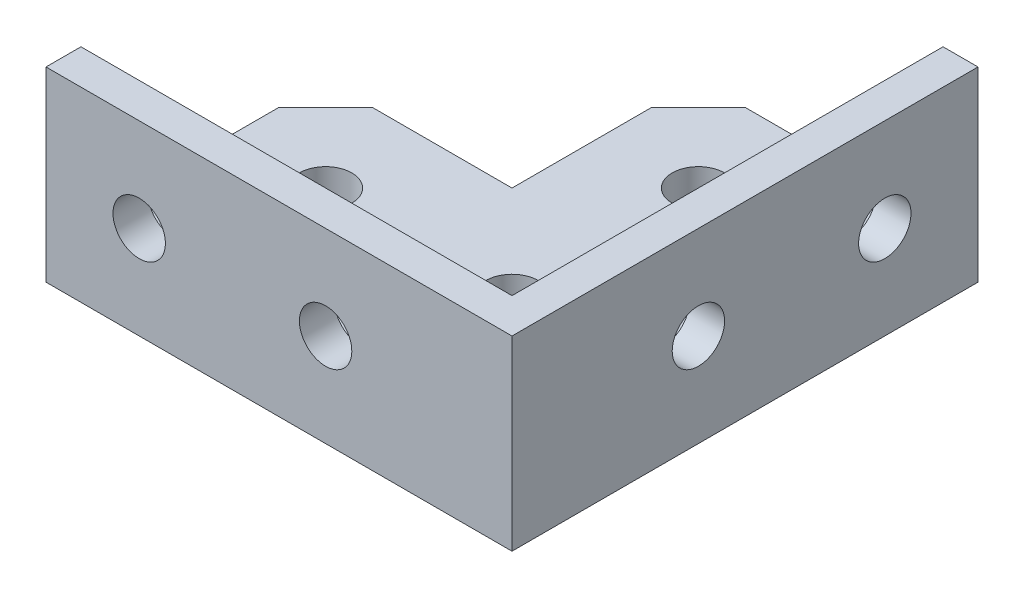
ISO-10303-21;
HEADER;
FILE_DESCRIPTION(('STEP AP214'),'2;1');
FILE_NAME('part.step','',(''),(''),'','','');
FILE_SCHEMA(('AUTOMOTIVE_DESIGN { 1 0 10303 214 1 1 1 1 }'));
ENDSEC;
DATA;
#1=APPLICATION_CONTEXT('core data for automotive mechanical design processes');
#2=APPLICATION_PROTOCOL_DEFINITION('international standard','automotive_design',2000,#1);
#3=PRODUCT_CONTEXT('',#1,'mechanical');
#4=PRODUCT('Part','Part','',(#3));
#5=PRODUCT_RELATED_PRODUCT_CATEGORY('part','',(#4));
#6=PRODUCT_DEFINITION_FORMATION('','',#4);
#7=PRODUCT_DEFINITION_CONTEXT('part definition',#1,'design');
#8=PRODUCT_DEFINITION('design','',#6,#7);
#9=PRODUCT_DEFINITION_SHAPE('','',#8);
#10=(LENGTH_UNIT() NAMED_UNIT(*) SI_UNIT(.MILLI.,.METRE.));
#11=(NAMED_UNIT(*) PLANE_ANGLE_UNIT() SI_UNIT($,.RADIAN.));
#12=(NAMED_UNIT(*) SI_UNIT($,.STERADIAN.) SOLID_ANGLE_UNIT());
#13=UNCERTAINTY_MEASURE_WITH_UNIT(LENGTH_MEASURE(1.E-05),#10,'distance_accuracy_value','');
#14=(GEOMETRIC_REPRESENTATION_CONTEXT(3) GLOBAL_UNCERTAINTY_ASSIGNED_CONTEXT((#13)) GLOBAL_UNIT_ASSIGNED_CONTEXT((#10,
#11,#12)) REPRESENTATION_CONTEXT('',''));
#15=CARTESIAN_POINT('',(0.,0.,0.));
#16=DIRECTION('',(0.,0.,1.));
#17=DIRECTION('',(1.,0.,0.));
#18=AXIS2_PLACEMENT_3D('',#15,#16,#17);
#19=CARTESIAN_POINT('',(33.3375,4.7625,63.5));
#20=DIRECTION('',(0.,-1.,0.));
#21=DIRECTION('',(1.,0.,0.));
#22=AXIS2_PLACEMENT_3D('',#19,#20,#21);
#23=PLANE('',#22);
#24=DIRECTION('',(-1.,0.,0.));
#25=VECTOR('',#24,1.);
#26=CARTESIAN_POINT('',(38.1,4.7625,25.4));
#27=LINE('',#26,#25);
#28=CARTESIAN_POINT('',(0.,4.7625,25.4));
#29=VERTEX_POINT('',#28);
#30=CARTESIAN_POINT('',(-19.05,4.7625,25.4));
#31=VERTEX_POINT('',#30);
#32=EDGE_CURVE('E180',#29,#31,#27,.T.);
#33=ORIENTED_EDGE('',*,*,#32,.T.);
#34=DIRECTION('',(0.707106781186549,0.,-0.707106781186546));
#35=VECTOR('',#34,1.);
#36=CARTESIAN_POINT('',(-25.4,4.7625,31.75));
#37=LINE('',#36,#35);
#38=CARTESIAN_POINT('',(-25.4,4.7625,31.75));
#39=VERTEX_POINT('',#38);
#40=EDGE_CURVE('E277',#31,#39,#37,.F.);
#41=ORIENTED_EDGE('',*,*,#40,.T.);
#42=DIRECTION('',(0.,0.,-1.));
#43=VECTOR('',#42,1.);
#44=CARTESIAN_POINT('',(-25.4,4.7625,58.7375));
#45=LINE('',#44,#43);
#46=CARTESIAN_POINT('',(-25.4,4.7625,58.7375));
#47=VERTEX_POINT('',#46);
#48=EDGE_CURVE('E175',#47,#39,#45,.T.);
#49=ORIENTED_EDGE('',*,*,#48,.F.);
#50=DIRECTION('',(-1.,0.,0.));
#51=VECTOR('',#50,1.);
#52=CARTESIAN_POINT('',(38.1,4.7625,58.7375));
#53=LINE('',#52,#51);
#54=CARTESIAN_POINT('',(33.3375,4.7625,58.7375));
#55=VERTEX_POINT('',#54);
#56=EDGE_CURVE('E156',#55,#47,#53,.T.);
#57=ORIENTED_EDGE('',*,*,#56,.F.);
#58=DIRECTION('',(0.,0.,-1.));
#59=VECTOR('',#58,1.);
#60=CARTESIAN_POINT('',(33.3375,4.7625,63.5));
#61=LINE('',#60,#59);
#62=CARTESIAN_POINT('',(33.3375,4.7625,0.));
#63=VERTEX_POINT('',#62);
#64=EDGE_CURVE('E259',#55,#63,#61,.T.);
#65=ORIENTED_EDGE('',*,*,#64,.T.);
#66=DIRECTION('',(-1.,0.,0.));
#67=VECTOR('',#66,1.);
#68=CARTESIAN_POINT('',(33.3375,4.7625,0.));
#69=LINE('',#68,#67);
#70=CARTESIAN_POINT('',(6.35000000000001,4.7625,0.));
#71=VERTEX_POINT('',#70);
#72=EDGE_CURVE('E231',#63,#71,#69,.T.);
#73=ORIENTED_EDGE('',*,*,#72,.T.);
#74=DIRECTION('',(-0.707106781186548,0.,0.707106781186547));
#75=VECTOR('',#74,1.);
#76=CARTESIAN_POINT('',(0.,4.7625,6.34999999999999));
#77=LINE('',#76,#75);
#78=CARTESIAN_POINT('',(0.,4.7625,6.34999999999999));
#79=VERTEX_POINT('',#78);
#80=EDGE_CURVE('E73',#71,#79,#77,.T.);
#81=ORIENTED_EDGE('',*,*,#80,.T.);
#82=DIRECTION('',(0.,0.,-1.));
#83=VECTOR('',#82,1.);
#84=CARTESIAN_POINT('',(0.,4.7625,63.5));
#85=LINE('',#84,#83);
#86=EDGE_CURVE('E256',#29,#79,#85,.T.);
#87=ORIENTED_EDGE('',*,*,#86,.F.);
#88=EDGE_LOOP('',(#33,#41,#49,#57,#65,#73,#81,#87));
#89=FACE_BOUND('',#88,.T.);
#90=CARTESIAN_POINT('',(12.7,4.7625,12.7));
#91=DIRECTION('',(0.,1.,0.));
#92=DIRECTION('',(0.,0.,1.));
#93=AXIS2_PLACEMENT_3D('',#90,#91,#92);
#94=CIRCLE('',#93,3.57124);
#95=CARTESIAN_POINT('',(12.7,4.7625,16.27124));
#96=VERTEX_POINT('',#95);
#97=EDGE_CURVE('E209',#96,#96,#94,.T.);
#98=ORIENTED_EDGE('',*,*,#97,.F.);
#99=EDGE_LOOP('',(#98));
#100=FACE_BOUND('',#99,.T.);
#101=CARTESIAN_POINT('',(-12.7,4.7625,38.1));
#102=DIRECTION('',(0.,1.,0.));
#103=DIRECTION('',(0.,0.,1.));
#104=AXIS2_PLACEMENT_3D('',#101,#102,#103);
#105=CIRCLE('',#104,3.57124);
#106=CARTESIAN_POINT('',(-12.7,4.7625,41.67124));
#107=VERTEX_POINT('',#106);
#108=EDGE_CURVE('E409',#107,#107,#105,.T.);
#109=ORIENTED_EDGE('',*,*,#108,.F.);
#110=EDGE_LOOP('',(#109));
#111=FACE_BOUND('',#110,.T.);
#112=CARTESIAN_POINT('',(12.7,4.7625,38.1));
#113=DIRECTION('',(0.,1.,0.));
#114=DIRECTION('',(0.,0.,1.));
#115=AXIS2_PLACEMENT_3D('',#112,#113,#114);
#116=CIRCLE('',#115,3.57124);
#117=CARTESIAN_POINT('',(12.7,4.7625,41.67124));
#118=VERTEX_POINT('',#117);
#119=EDGE_CURVE('E401',#118,#118,#116,.T.);
#120=ORIENTED_EDGE('',*,*,#119,.F.);
#121=EDGE_LOOP('',(#120));
#122=FACE_BOUND('',#121,.T.);
#123=ADVANCED_FACE('F51',(#89,#100,#111,#122),#23,.F.);
#124=CARTESIAN_POINT('',(33.3375,25.4,63.5));
#125=DIRECTION('',(1.,0.,0.));
#126=DIRECTION('',(0.,0.,-1.));
#127=AXIS2_PLACEMENT_3D('',#124,#125,#126);
#128=PLANE('',#127);
#129=ORIENTED_EDGE('',*,*,#64,.F.);
#130=DIRECTION('',(0.,1.,0.));
#131=VECTOR('',#130,1.);
#132=CARTESIAN_POINT('',(33.3375,25.4,58.7375));
#133=LINE('',#132,#131);
#134=CARTESIAN_POINT('',(33.3375,25.4,58.7375));
#135=VERTEX_POINT('',#134);
#136=EDGE_CURVE('E150',#55,#135,#133,.T.);
#137=ORIENTED_EDGE('',*,*,#136,.T.);
#138=DIRECTION('',(0.,0.,-1.));
#139=VECTOR('',#138,1.);
#140=CARTESIAN_POINT('',(33.3375,25.4,63.5));
#141=LINE('',#140,#139);
#142=CARTESIAN_POINT('',(33.3375,25.4,0.));
#143=VERTEX_POINT('',#142);
#144=EDGE_CURVE('E146',#135,#143,#141,.T.);
#145=ORIENTED_EDGE('',*,*,#144,.T.);
#146=DIRECTION('',(0.,-1.,0.));
#147=VECTOR('',#146,1.);
#148=CARTESIAN_POINT('',(33.3375,25.4,0.));
#149=LINE('',#148,#147);
#150=EDGE_CURVE('E217',#143,#63,#149,.T.);
#151=ORIENTED_EDGE('',*,*,#150,.T.);
#152=EDGE_LOOP('',(#129,#137,#145,#151));
#153=FACE_BOUND('',#152,.T.);
#154=CARTESIAN_POINT('',(33.3375,12.7,38.1));
#155=DIRECTION('',(-1.,0.,0.));
#156=DIRECTION('',(0.,0.,1.));
#157=AXIS2_PLACEMENT_3D('',#154,#155,#156);
#158=CIRCLE('',#157,3.57124);
#159=CARTESIAN_POINT('',(33.3375,12.7,41.67124));
#160=VERTEX_POINT('',#159);
#161=EDGE_CURVE('E201',#160,#160,#158,.T.);
#162=ORIENTED_EDGE('',*,*,#161,.F.);
#163=EDGE_LOOP('',(#162));
#164=FACE_BOUND('',#163,.T.);
#165=CARTESIAN_POINT('',(33.3375,12.7,12.7));
#166=DIRECTION('',(-1.,0.,0.));
#167=DIRECTION('',(0.,0.,1.));
#168=AXIS2_PLACEMENT_3D('',#165,#166,#167);
#169=CIRCLE('',#168,3.57124);
#170=CARTESIAN_POINT('',(33.3375,12.7,16.27124));
#171=VERTEX_POINT('',#170);
#172=EDGE_CURVE('E193',#171,#171,#169,.T.);
#173=ORIENTED_EDGE('',*,*,#172,.F.);
#174=EDGE_LOOP('',(#173));
#175=FACE_BOUND('',#174,.T.);
#176=ADVANCED_FACE('F314',(#153,#164,#175),#128,.F.);
#177=CARTESIAN_POINT('',(0.,4.7625,63.5));
#178=DIRECTION('',(1.,0.,0.));
#179=DIRECTION('',(0.,1.,0.));
#180=AXIS2_PLACEMENT_3D('',#177,#178,#179);
#181=PLANE('',#180);
#182=ORIENTED_EDGE('',*,*,#86,.T.);
#183=DIRECTION('',(0.,-1.,0.));
#184=VECTOR('',#183,1.);
#185=CARTESIAN_POINT('',(0.,0.,6.34999999999999));
#186=LINE('',#185,#184);
#187=CARTESIAN_POINT('',(0.,0.,6.34999999999999));
#188=VERTEX_POINT('',#187);
#189=EDGE_CURVE('E61',#79,#188,#186,.T.);
#190=ORIENTED_EDGE('',*,*,#189,.T.);
#191=DIRECTION('',(0.,0.,-1.));
#192=VECTOR('',#191,1.);
#193=CARTESIAN_POINT('',(0.,0.,63.5));
#194=LINE('',#193,#192);
#195=CARTESIAN_POINT('',(0.,0.,25.4));
#196=VERTEX_POINT('',#195);
#197=EDGE_CURVE('E252',#196,#188,#194,.T.);
#198=ORIENTED_EDGE('',*,*,#197,.F.);
#199=DIRECTION('',(0.,1.,0.));
#200=VECTOR('',#199,1.);
#201=CARTESIAN_POINT('',(0.,4.7625,25.4));
#202=LINE('',#201,#200);
#203=EDGE_CURVE('E189',#196,#29,#202,.T.);
#204=ORIENTED_EDGE('',*,*,#203,.T.);
#205=EDGE_LOOP('',(#182,#190,#198,#204));
#206=FACE_BOUND('',#205,.T.);
#207=ADVANCED_FACE('F283',(#206),#181,.F.);
#208=CARTESIAN_POINT('',(0.,0.,63.5));
#209=DIRECTION('',(0.,1.,0.));
#210=DIRECTION('',(0.,0.,1.));
#211=AXIS2_PLACEMENT_3D('',#208,#209,#210);
#212=PLANE('',#211);
#213=CARTESIAN_POINT('',(12.7,0.,38.1));
#214=DIRECTION('',(0.,1.,0.));
#215=DIRECTION('',(0.,0.,1.));
#216=AXIS2_PLACEMENT_3D('',#213,#214,#215);
#217=CIRCLE('',#216,3.57124);
#218=CARTESIAN_POINT('',(12.7,0.,41.67124));
#219=VERTEX_POINT('',#218);
#220=EDGE_CURVE('E405',#219,#219,#217,.T.);
#221=ORIENTED_EDGE('',*,*,#220,.T.);
#222=EDGE_LOOP('',(#221));
#223=FACE_BOUND('',#222,.T.);
#224=CARTESIAN_POINT('',(-12.7,0.,38.1));
#225=DIRECTION('',(0.,1.,0.));
#226=DIRECTION('',(0.,0.,1.));
#227=AXIS2_PLACEMENT_3D('',#224,#225,#226);
#228=CIRCLE('',#227,3.57124);
#229=CARTESIAN_POINT('',(-12.7,0.,41.67124));
#230=VERTEX_POINT('',#229);
#231=EDGE_CURVE('E161',#230,#230,#228,.T.);
#232=ORIENTED_EDGE('',*,*,#231,.T.);
#233=EDGE_LOOP('',(#232));
#234=FACE_BOUND('',#233,.T.);
#235=CARTESIAN_POINT('',(12.7,0.,12.7));
#236=DIRECTION('',(0.,1.,0.));
#237=DIRECTION('',(0.,0.,1.));
#238=AXIS2_PLACEMENT_3D('',#235,#236,#237);
#239=CIRCLE('',#238,3.57124);
#240=CARTESIAN_POINT('',(12.7,0.,16.27124));
#241=VERTEX_POINT('',#240);
#242=EDGE_CURVE('E213',#241,#241,#239,.T.);
#243=ORIENTED_EDGE('',*,*,#242,.T.);
#244=EDGE_LOOP('',(#243));
#245=FACE_BOUND('',#244,.T.);
#246=DIRECTION('',(0.,0.,1.));
#247=VECTOR('',#246,1.);
#248=CARTESIAN_POINT('',(-25.4,0.,25.4));
#249=LINE('',#248,#247);
#250=CARTESIAN_POINT('',(-25.4,0.,31.75));
#251=VERTEX_POINT('',#250);
#252=CARTESIAN_POINT('',(-25.4,0.,63.5));
#253=VERTEX_POINT('',#252);
#254=EDGE_CURVE('E169',#251,#253,#249,.T.);
#255=ORIENTED_EDGE('',*,*,#254,.F.);
#256=DIRECTION('',(-0.707106781186549,0.,0.707106781186546));
#257=VECTOR('',#256,1.);
#258=CARTESIAN_POINT('',(-25.4,0.,31.75));
#259=LINE('',#258,#257);
#260=CARTESIAN_POINT('',(-19.05,0.,25.4));
#261=VERTEX_POINT('',#260);
#262=EDGE_CURVE('E269',#251,#261,#259,.F.);
#263=ORIENTED_EDGE('',*,*,#262,.T.);
#264=DIRECTION('',(-1.,0.,0.));
#265=VECTOR('',#264,1.);
#266=CARTESIAN_POINT('',(38.1,0.,25.4));
#267=LINE('',#266,#265);
#268=EDGE_CURVE('E151',#196,#261,#267,.T.);
#269=ORIENTED_EDGE('',*,*,#268,.F.);
#270=ORIENTED_EDGE('',*,*,#197,.T.);
#271=DIRECTION('',(0.707106781186548,0.,-0.707106781186547));
#272=VECTOR('',#271,1.);
#273=CARTESIAN_POINT('',(0.,0.,6.34999999999999));
#274=LINE('',#273,#272);
#275=CARTESIAN_POINT('',(6.35000000000001,0.,0.));
#276=VERTEX_POINT('',#275);
#277=EDGE_CURVE('E266',#188,#276,#274,.T.);
#278=ORIENTED_EDGE('',*,*,#277,.T.);
#279=DIRECTION('',(1.,0.,0.));
#280=VECTOR('',#279,1.);
#281=CARTESIAN_POINT('',(0.,0.,0.));
#282=LINE('',#281,#280);
#283=CARTESIAN_POINT('',(38.1,0.,0.));
#284=VERTEX_POINT('',#283);
#285=EDGE_CURVE('E234',#276,#284,#282,.T.);
#286=ORIENTED_EDGE('',*,*,#285,.T.);
#287=DIRECTION('',(0.,0.,-1.));
#288=VECTOR('',#287,1.);
#289=CARTESIAN_POINT('',(38.1,0.,63.5));
#290=LINE('',#289,#288);
#291=CARTESIAN_POINT('',(38.1,0.,63.5));
#292=VERTEX_POINT('',#291);
#293=EDGE_CURVE('E248',#292,#284,#290,.T.);
#294=ORIENTED_EDGE('',*,*,#293,.F.);
#295=DIRECTION('',(1.,0.,0.));
#296=VECTOR('',#295,1.);
#297=CARTESIAN_POINT('',(0.,0.,63.5));
#298=LINE('',#297,#296);
#299=EDGE_CURVE('E218',#253,#292,#298,.T.);
#300=ORIENTED_EDGE('',*,*,#299,.F.);
#301=EDGE_LOOP('',(#255,#263,#269,#270,#278,#286,#294,#300));
#302=FACE_BOUND('',#301,.T.);
#303=ADVANCED_FACE('F289',(#223,#234,#245,#302),#212,.F.);
#304=CARTESIAN_POINT('',(38.1,0.,63.5));
#305=DIRECTION('',(-1.,0.,0.));
#306=DIRECTION('',(0.,0.,1.));
#307=AXIS2_PLACEMENT_3D('',#304,#305,#306);
#308=PLANE('',#307);
#309=ORIENTED_EDGE('',*,*,#293,.T.);
#310=DIRECTION('',(0.,1.,0.));
#311=VECTOR('',#310,1.);
#312=CARTESIAN_POINT('',(38.1,0.,0.));
#313=LINE('',#312,#311);
#314=CARTESIAN_POINT('',(38.1,25.4,0.));
#315=VERTEX_POINT('',#314);
#316=EDGE_CURVE('E237',#284,#315,#313,.T.);
#317=ORIENTED_EDGE('',*,*,#316,.T.);
#318=DIRECTION('',(0.,0.,-1.));
#319=VECTOR('',#318,1.);
#320=CARTESIAN_POINT('',(38.1,25.4,63.5));
#321=LINE('',#320,#319);
#322=CARTESIAN_POINT('',(38.1,25.4,63.5));
#323=VERTEX_POINT('',#322);
#324=EDGE_CURVE('E245',#323,#315,#321,.T.);
#325=ORIENTED_EDGE('',*,*,#324,.F.);
#326=DIRECTION('',(0.,1.,0.));
#327=VECTOR('',#326,1.);
#328=CARTESIAN_POINT('',(38.1,0.,63.5));
#329=LINE('',#328,#327);
#330=EDGE_CURVE('E221',#292,#323,#329,.T.);
#331=ORIENTED_EDGE('',*,*,#330,.F.);
#332=EDGE_LOOP('',(#309,#317,#325,#331));
#333=FACE_BOUND('',#332,.T.);
#334=CARTESIAN_POINT('',(38.1,12.7,12.7));
#335=DIRECTION('',(-1.,0.,0.));
#336=DIRECTION('',(0.,0.,1.));
#337=AXIS2_PLACEMENT_3D('',#334,#335,#336);
#338=CIRCLE('',#337,3.57124);
#339=CARTESIAN_POINT('',(38.1,12.7,16.27124));
#340=VERTEX_POINT('',#339);
#341=EDGE_CURVE('E197',#340,#340,#338,.T.);
#342=ORIENTED_EDGE('',*,*,#341,.T.);
#343=EDGE_LOOP('',(#342));
#344=FACE_BOUND('',#343,.T.);
#345=CARTESIAN_POINT('',(38.1,12.7,38.1));
#346=DIRECTION('',(-1.,0.,0.));
#347=DIRECTION('',(0.,0.,1.));
#348=AXIS2_PLACEMENT_3D('',#345,#346,#347);
#349=CIRCLE('',#348,3.57124);
#350=CARTESIAN_POINT('',(38.1,12.7,41.67124));
#351=VERTEX_POINT('',#350);
#352=EDGE_CURVE('E205',#351,#351,#349,.T.);
#353=ORIENTED_EDGE('',*,*,#352,.T.);
#354=EDGE_LOOP('',(#353));
#355=FACE_BOUND('',#354,.T.);
#356=ADVANCED_FACE('F309',(#333,#344,#355),#308,.F.);
#357=CARTESIAN_POINT('',(38.1,25.4,63.5));
#358=DIRECTION('',(0.,-1.,0.));
#359=DIRECTION('',(1.,0.,0.));
#360=AXIS2_PLACEMENT_3D('',#357,#358,#359);
#361=PLANE('',#360);
#362=ORIENTED_EDGE('',*,*,#144,.F.);
#363=DIRECTION('',(-1.,0.,0.));
#364=VECTOR('',#363,1.);
#365=CARTESIAN_POINT('',(38.1,25.4,58.7375));
#366=LINE('',#365,#364);
#367=CARTESIAN_POINT('',(-25.4,25.4,58.7375));
#368=VERTEX_POINT('',#367);
#369=EDGE_CURVE('E138',#135,#368,#366,.T.);
#370=ORIENTED_EDGE('',*,*,#369,.T.);
#371=DIRECTION('',(0.,0.,-1.));
#372=VECTOR('',#371,1.);
#373=CARTESIAN_POINT('',(-25.4,25.4,63.5));
#374=LINE('',#373,#372);
#375=CARTESIAN_POINT('',(-25.4,25.4,63.5));
#376=VERTEX_POINT('',#375);
#377=EDGE_CURVE('E143',#376,#368,#374,.T.);
#378=ORIENTED_EDGE('',*,*,#377,.F.);
#379=DIRECTION('',(-1.,0.,0.));
#380=VECTOR('',#379,1.);
#381=CARTESIAN_POINT('',(38.1,25.4,63.5));
#382=LINE('',#381,#380);
#383=EDGE_CURVE('E225',#323,#376,#382,.T.);
#384=ORIENTED_EDGE('',*,*,#383,.F.);
#385=ORIENTED_EDGE('',*,*,#324,.T.);
#386=DIRECTION('',(-1.,0.,0.));
#387=VECTOR('',#386,1.);
#388=CARTESIAN_POINT('',(38.1,25.4,0.));
#389=LINE('',#388,#387);
#390=EDGE_CURVE('E222',#315,#143,#389,.T.);
#391=ORIENTED_EDGE('',*,*,#390,.T.);
#392=EDGE_LOOP('',(#362,#370,#378,#384,#385,#391));
#393=FACE_BOUND('',#392,.T.);
#394=ADVANCED_FACE('F140',(#393),#361,.F.);
#395=CARTESIAN_POINT('',(0.,0.,63.5));
#396=DIRECTION('',(0.,0.,-1.));
#397=DIRECTION('',(-1.,0.,0.));
#398=AXIS2_PLACEMENT_3D('',#395,#396,#397);
#399=PLANE('',#398);
#400=CARTESIAN_POINT('',(-12.7,12.7,63.5));
#401=DIRECTION('',(0.,0.,-1.));
#402=DIRECTION('',(-1.,0.,0.));
#403=AXIS2_PLACEMENT_3D('',#400,#401,#402);
#404=CIRCLE('',#403,3.57124);
#405=CARTESIAN_POINT('',(-16.27124,12.7,63.5));
#406=VERTEX_POINT('',#405);
#407=EDGE_CURVE('E384',#406,#406,#404,.T.);
#408=ORIENTED_EDGE('',*,*,#407,.T.);
#409=EDGE_LOOP('',(#408));
#410=FACE_BOUND('',#409,.T.);
#411=CARTESIAN_POINT('',(12.7,12.7,63.5));
#412=DIRECTION('',(0.,0.,-1.));
#413=DIRECTION('',(-1.,0.,0.));
#414=AXIS2_PLACEMENT_3D('',#411,#412,#413);
#415=CIRCLE('',#414,3.57124);
#416=CARTESIAN_POINT('',(9.12876000000001,12.7,63.5));
#417=VERTEX_POINT('',#416);
#418=EDGE_CURVE('E397',#417,#417,#415,.T.);
#419=ORIENTED_EDGE('',*,*,#418,.T.);
#420=EDGE_LOOP('',(#419));
#421=FACE_BOUND('',#420,.T.);
#422=ORIENTED_EDGE('',*,*,#383,.T.);
#423=DIRECTION('',(0.,1.,0.));
#424=VECTOR('',#423,1.);
#425=CARTESIAN_POINT('',(-25.4,0.,63.5));
#426=LINE('',#425,#424);
#427=EDGE_CURVE('E165',#253,#376,#426,.T.);
#428=ORIENTED_EDGE('',*,*,#427,.F.);
#429=ORIENTED_EDGE('',*,*,#299,.T.);
#430=ORIENTED_EDGE('',*,*,#330,.T.);
#431=EDGE_LOOP('',(#422,#428,#429,#430));
#432=FACE_BOUND('',#431,.T.);
#433=ADVANCED_FACE('F303',(#410,#421,#432),#399,.F.);
#434=CARTESIAN_POINT('',(0.,0.,0.));
#435=DIRECTION('',(0.,0.,-1.));
#436=DIRECTION('',(-1.,0.,0.));
#437=AXIS2_PLACEMENT_3D('',#434,#435,#436);
#438=PLANE('',#437);
#439=ORIENTED_EDGE('',*,*,#285,.F.);
#440=DIRECTION('',(0.,1.,0.));
#441=VECTOR('',#440,1.);
#442=CARTESIAN_POINT('',(6.35000000000001,4.7625,0.));
#443=LINE('',#442,#441);
#444=EDGE_CURVE('E11',#276,#71,#443,.T.);
#445=ORIENTED_EDGE('',*,*,#444,.T.);
#446=ORIENTED_EDGE('',*,*,#72,.F.);
#447=ORIENTED_EDGE('',*,*,#150,.F.);
#448=ORIENTED_EDGE('',*,*,#390,.F.);
#449=ORIENTED_EDGE('',*,*,#316,.F.);
#450=EDGE_LOOP('',(#439,#445,#446,#447,#448,#449));
#451=FACE_BOUND('',#450,.T.);
#452=ADVANCED_FACE('F311',(#451),#438,.T.);
#453=CARTESIAN_POINT('',(12.7,4.7625,12.7));
#454=DIRECTION('',(0.,1.,0.));
#455=DIRECTION('',(0.,0.,1.));
#456=AXIS2_PLACEMENT_3D('',#453,#454,#455);
#457=CYLINDRICAL_SURFACE('',#456,3.57124);
#458=ORIENTED_EDGE('',*,*,#242,.F.);
#459=EDGE_LOOP('',(#458));
#460=FACE_BOUND('',#459,.T.);
#461=ORIENTED_EDGE('',*,*,#97,.T.);
#462=EDGE_LOOP('',(#461));
#463=FACE_BOUND('',#462,.T.);
#464=ADVANCED_FACE('F343',(#460,#463),#457,.F.);
#465=CARTESIAN_POINT('',(33.3375,12.7,38.1));
#466=DIRECTION('',(-1.,0.,0.));
#467=DIRECTION('',(0.,0.,1.));
#468=AXIS2_PLACEMENT_3D('',#465,#466,#467);
#469=CYLINDRICAL_SURFACE('',#468,3.57124);
#470=ORIENTED_EDGE('',*,*,#352,.F.);
#471=EDGE_LOOP('',(#470));
#472=FACE_BOUND('',#471,.T.);
#473=ORIENTED_EDGE('',*,*,#161,.T.);
#474=EDGE_LOOP('',(#473));
#475=FACE_BOUND('',#474,.T.);
#476=ADVANCED_FACE('F349',(#472,#475),#469,.F.);
#477=CARTESIAN_POINT('',(33.3375,12.7,12.7));
#478=DIRECTION('',(-1.,0.,0.));
#479=DIRECTION('',(0.,0.,1.));
#480=AXIS2_PLACEMENT_3D('',#477,#478,#479);
#481=CYLINDRICAL_SURFACE('',#480,3.57124);
#482=ORIENTED_EDGE('',*,*,#341,.F.);
#483=EDGE_LOOP('',(#482));
#484=FACE_BOUND('',#483,.T.);
#485=ORIENTED_EDGE('',*,*,#172,.T.);
#486=EDGE_LOOP('',(#485));
#487=FACE_BOUND('',#486,.T.);
#488=ADVANCED_FACE('F353',(#484,#487),#481,.F.);
#489=CARTESIAN_POINT('',(38.1,4.7625,25.4));
#490=DIRECTION('',(0.,0.,-1.));
#491=DIRECTION('',(-1.,0.,0.));
#492=AXIS2_PLACEMENT_3D('',#489,#490,#491);
#493=PLANE('',#492);
#494=ORIENTED_EDGE('',*,*,#268,.T.);
#495=DIRECTION('',(0.,1.,0.));
#496=VECTOR('',#495,1.);
#497=CARTESIAN_POINT('',(-19.05,4.7625,25.4));
#498=LINE('',#497,#496);
#499=EDGE_CURVE('E272',#261,#31,#498,.T.);
#500=ORIENTED_EDGE('',*,*,#499,.T.);
#501=ORIENTED_EDGE('',*,*,#32,.F.);
#502=ORIENTED_EDGE('',*,*,#203,.F.);
#503=EDGE_LOOP('',(#494,#500,#501,#502));
#504=FACE_BOUND('',#503,.T.);
#505=ADVANCED_FACE('F292',(#504),#493,.T.);
#506=CARTESIAN_POINT('',(38.1,25.4,58.7375));
#507=DIRECTION('',(0.,0.,-1.));
#508=DIRECTION('',(-1.,0.,0.));
#509=AXIS2_PLACEMENT_3D('',#506,#507,#508);
#510=PLANE('',#509);
#511=CARTESIAN_POINT('',(-12.7,12.7,58.7375));
#512=DIRECTION('',(0.,0.,-1.));
#513=DIRECTION('',(0.,1.,0.));
#514=AXIS2_PLACEMENT_3D('',#511,#512,#513);
#515=CIRCLE('',#514,3.57124);
#516=CARTESIAN_POINT('',(-12.7,16.27124,58.7375));
#517=VERTEX_POINT('',#516);
#518=EDGE_CURVE('E387',#517,#517,#515,.T.);
#519=ORIENTED_EDGE('',*,*,#518,.F.);
#520=EDGE_LOOP('',(#519));
#521=FACE_BOUND('',#520,.T.);
#522=CARTESIAN_POINT('',(12.7,12.7,58.7375));
#523=DIRECTION('',(0.,0.,-1.));
#524=DIRECTION('',(0.,1.,0.));
#525=AXIS2_PLACEMENT_3D('',#522,#523,#524);
#526=CIRCLE('',#525,3.57124);
#527=CARTESIAN_POINT('',(12.7,16.27124,58.7375));
#528=VERTEX_POINT('',#527);
#529=EDGE_CURVE('E391',#528,#528,#526,.T.);
#530=ORIENTED_EDGE('',*,*,#529,.F.);
#531=EDGE_LOOP('',(#530));
#532=FACE_BOUND('',#531,.T.);
#533=ORIENTED_EDGE('',*,*,#136,.F.);
#534=ORIENTED_EDGE('',*,*,#56,.T.);
#535=DIRECTION('',(0.,-1.,0.));
#536=VECTOR('',#535,1.);
#537=CARTESIAN_POINT('',(-25.4,25.4,58.7375));
#538=LINE('',#537,#536);
#539=EDGE_CURVE('E154',#368,#47,#538,.T.);
#540=ORIENTED_EDGE('',*,*,#539,.F.);
#541=ORIENTED_EDGE('',*,*,#369,.F.);
#542=EDGE_LOOP('',(#533,#534,#540,#541));
#543=FACE_BOUND('',#542,.T.);
#544=ADVANCED_FACE('F155',(#521,#532,#543),#510,.T.);
#545=CARTESIAN_POINT('',(-25.4,0.,25.4));
#546=DIRECTION('',(-1.,0.,0.));
#547=DIRECTION('',(0.,0.,-1.));
#548=AXIS2_PLACEMENT_3D('',#545,#546,#547);
#549=PLANE('',#548);
#550=ORIENTED_EDGE('',*,*,#48,.T.);
#551=DIRECTION('',(0.,-1.,0.));
#552=VECTOR('',#551,1.);
#553=CARTESIAN_POINT('',(-25.4,0.,31.75));
#554=LINE('',#553,#552);
#555=EDGE_CURVE('E262',#39,#251,#554,.T.);
#556=ORIENTED_EDGE('',*,*,#555,.T.);
#557=ORIENTED_EDGE('',*,*,#254,.T.);
#558=ORIENTED_EDGE('',*,*,#427,.T.);
#559=ORIENTED_EDGE('',*,*,#377,.T.);
#560=ORIENTED_EDGE('',*,*,#539,.T.);
#561=EDGE_LOOP('',(#550,#556,#557,#558,#559,#560));
#562=FACE_BOUND('',#561,.T.);
#563=ADVANCED_FACE('F163',(#562),#549,.T.);
#564=CARTESIAN_POINT('',(-12.7,4.7625,38.1));
#565=DIRECTION('',(0.,1.,0.));
#566=DIRECTION('',(0.,0.,1.));
#567=AXIS2_PLACEMENT_3D('',#564,#565,#566);
#568=CYLINDRICAL_SURFACE('',#567,3.57124);
#569=ORIENTED_EDGE('',*,*,#231,.F.);
#570=EDGE_LOOP('',(#569));
#571=FACE_BOUND('',#570,.T.);
#572=ORIENTED_EDGE('',*,*,#108,.T.);
#573=EDGE_LOOP('',(#572));
#574=FACE_BOUND('',#573,.T.);
#575=ADVANCED_FACE('F365',(#571,#574),#568,.F.);
#576=CARTESIAN_POINT('',(12.7,4.7625,38.1));
#577=DIRECTION('',(0.,1.,0.));
#578=DIRECTION('',(0.,0.,1.));
#579=AXIS2_PLACEMENT_3D('',#576,#577,#578);
#580=CYLINDRICAL_SURFACE('',#579,3.57124);
#581=ORIENTED_EDGE('',*,*,#220,.F.);
#582=EDGE_LOOP('',(#581));
#583=FACE_BOUND('',#582,.T.);
#584=ORIENTED_EDGE('',*,*,#119,.T.);
#585=EDGE_LOOP('',(#584));
#586=FACE_BOUND('',#585,.T.);
#587=ADVANCED_FACE('F368',(#583,#586),#580,.F.);
#588=CARTESIAN_POINT('',(12.7,12.7,58.7375));
#589=DIRECTION('',(0.,0.,-1.));
#590=DIRECTION('',(0.,1.,0.));
#591=AXIS2_PLACEMENT_3D('',#588,#589,#590);
#592=CYLINDRICAL_SURFACE('',#591,3.57124);
#593=ORIENTED_EDGE('',*,*,#418,.F.);
#594=EDGE_LOOP('',(#593));
#595=FACE_BOUND('',#594,.T.);
#596=ORIENTED_EDGE('',*,*,#529,.T.);
#597=EDGE_LOOP('',(#596));
#598=FACE_BOUND('',#597,.T.);
#599=ADVANCED_FACE('F372',(#595,#598),#592,.F.);
#600=CARTESIAN_POINT('',(-12.7,12.7,58.7375));
#601=DIRECTION('',(0.,0.,-1.));
#602=DIRECTION('',(0.,1.,0.));
#603=AXIS2_PLACEMENT_3D('',#600,#601,#602);
#604=CYLINDRICAL_SURFACE('',#603,3.57124);
#605=ORIENTED_EDGE('',*,*,#407,.F.);
#606=EDGE_LOOP('',(#605));
#607=FACE_BOUND('',#606,.T.);
#608=ORIENTED_EDGE('',*,*,#518,.T.);
#609=EDGE_LOOP('',(#608));
#610=FACE_BOUND('',#609,.T.);
#611=ADVANCED_FACE('F320',(#607,#610),#604,.F.);
#612=CARTESIAN_POINT('',(-25.4,0.,31.75));
#613=DIRECTION('',(0.707106781186546,0.,0.707106781186549));
#614=DIRECTION('',(0.,-1.,0.));
#615=AXIS2_PLACEMENT_3D('',#612,#613,#614);
#616=PLANE('',#615);
#617=ORIENTED_EDGE('',*,*,#40,.F.);
#618=ORIENTED_EDGE('',*,*,#499,.F.);
#619=ORIENTED_EDGE('',*,*,#262,.F.);
#620=ORIENTED_EDGE('',*,*,#555,.F.);
#621=EDGE_LOOP('',(#617,#618,#619,#620));
#622=FACE_BOUND('',#621,.T.);
#623=ADVANCED_FACE('F296',(#622),#616,.F.);
#624=CARTESIAN_POINT('',(0.,4.7625,6.34999999999999));
#625=DIRECTION('',(-0.707106781186547,0.,-0.707106781186548));
#626=DIRECTION('',(0.,1.,0.));
#627=AXIS2_PLACEMENT_3D('',#624,#625,#626);
#628=PLANE('',#627);
#629=ORIENTED_EDGE('',*,*,#80,.F.);
#630=ORIENTED_EDGE('',*,*,#444,.F.);
#631=ORIENTED_EDGE('',*,*,#277,.F.);
#632=ORIENTED_EDGE('',*,*,#189,.F.);
#633=EDGE_LOOP('',(#629,#630,#631,#632));
#634=FACE_BOUND('',#633,.T.);
#635=ADVANCED_FACE('F54',(#634),#628,.T.);
#636=CLOSED_SHELL('',(#123,#176,#207,#303,#356,#394,#433,#452,#464,#476,#488,#505,#544,#563,
#575,#587,#599,#611,#623,#635));
#637=MANIFOLD_SOLID_BREP('B2',#636);
#638=ADVANCED_BREP_SHAPE_REPRESENTATION('',(#18,#637),#14);
#639=SHAPE_DEFINITION_REPRESENTATION(#9,#638);
ENDSEC;
END-ISO-10303-21;
